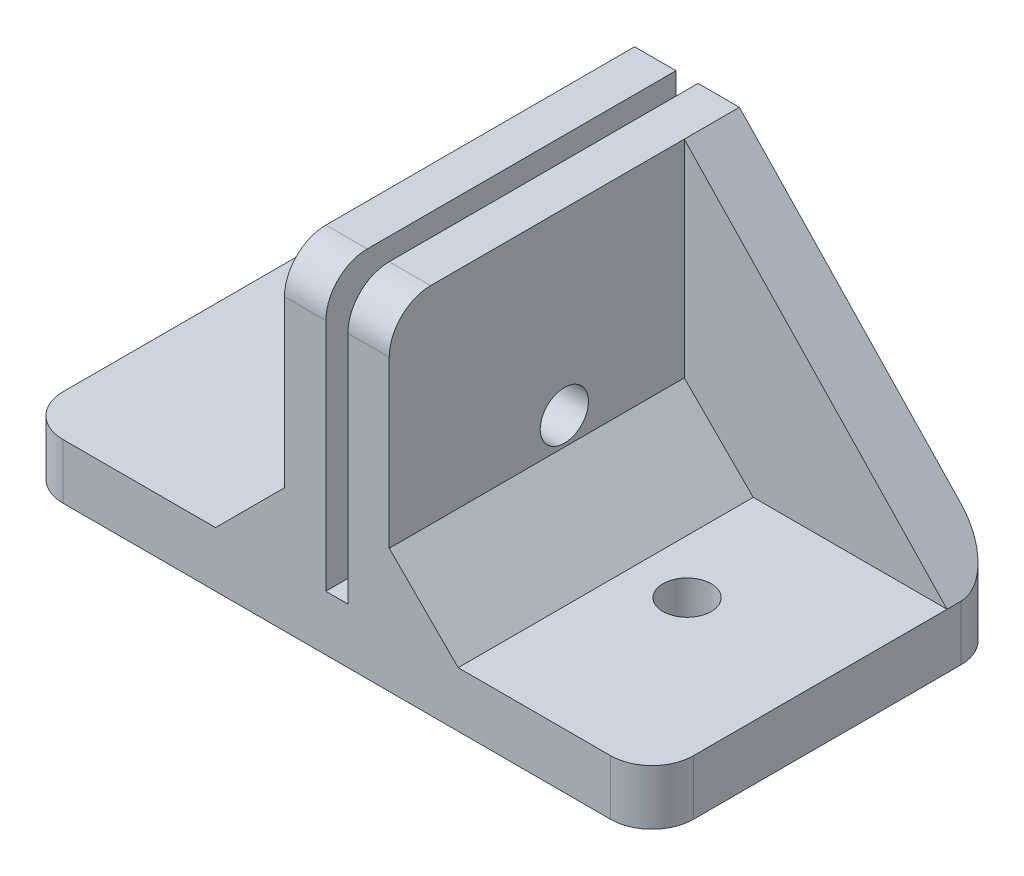
ISO-10303-21;
HEADER;
FILE_DESCRIPTION(('STEP AP214'),'2;1');
FILE_NAME('part.step','',(''),(''),'','','');
FILE_SCHEMA(('AUTOMOTIVE_DESIGN { 1 0 10303 214 1 1 1 1 }'));
ENDSEC;
DATA;
#1=APPLICATION_CONTEXT('core data for automotive mechanical design processes');
#2=APPLICATION_PROTOCOL_DEFINITION('international standard','automotive_design',2000,#1);
#3=PRODUCT_CONTEXT('',#1,'mechanical');
#4=PRODUCT('Part','Part','',(#3));
#5=PRODUCT_RELATED_PRODUCT_CATEGORY('part','',(#4));
#6=PRODUCT_DEFINITION_FORMATION('','',#4);
#7=PRODUCT_DEFINITION_CONTEXT('part definition',#1,'design');
#8=PRODUCT_DEFINITION('design','',#6,#7);
#9=PRODUCT_DEFINITION_SHAPE('','',#8);
#10=(LENGTH_UNIT() NAMED_UNIT(*) SI_UNIT(.MILLI.,.METRE.));
#11=(NAMED_UNIT(*) PLANE_ANGLE_UNIT() SI_UNIT($,.RADIAN.));
#12=(NAMED_UNIT(*) SI_UNIT($,.STERADIAN.) SOLID_ANGLE_UNIT());
#13=UNCERTAINTY_MEASURE_WITH_UNIT(LENGTH_MEASURE(1.E-05),#10,'distance_accuracy_value','');
#14=(GEOMETRIC_REPRESENTATION_CONTEXT(3) GLOBAL_UNCERTAINTY_ASSIGNED_CONTEXT((#13)) GLOBAL_UNIT_ASSIGNED_CONTEXT((#10,
#11,#12)) REPRESENTATION_CONTEXT('',''));
#15=CARTESIAN_POINT('',(0.,0.,0.));
#16=DIRECTION('',(0.,0.,1.));
#17=DIRECTION('',(1.,0.,0.));
#18=AXIS2_PLACEMENT_3D('',#15,#16,#17);
#19=CARTESIAN_POINT('',(0.,4.,0.));
#20=DIRECTION('',(0.,1.,0.));
#21=DIRECTION('',(0.,0.,1.));
#22=AXIS2_PLACEMENT_3D('',#19,#20,#21);
#23=PLANE('',#22);
#24=DIRECTION('',(1.,0.,0.));
#25=VECTOR('',#24,1.);
#26=CARTESIAN_POINT('',(-22.86,4.,12.7));
#27=LINE('',#26,#25);
#28=CARTESIAN_POINT('',(-0.799999999999999,4.,12.7));
#29=VERTEX_POINT('',#28);
#30=CARTESIAN_POINT('',(0.800000000000002,4.,12.7));
#31=VERTEX_POINT('',#30);
#32=EDGE_CURVE('E248',#29,#31,#27,.T.);
#33=ORIENTED_EDGE('',*,*,#32,.T.);
#34=DIRECTION('',(0.,0.,1.));
#35=VECTOR('',#34,1.);
#36=CARTESIAN_POINT('',(0.799999999999999,4.,-12.7));
#37=LINE('',#36,#35);
#38=CARTESIAN_POINT('',(0.799999999999999,4.,-12.7));
#39=VERTEX_POINT('',#38);
#40=EDGE_CURVE('E368',#39,#31,#37,.T.);
#41=ORIENTED_EDGE('',*,*,#40,.F.);
#42=DIRECTION('',(-1.,0.,0.));
#43=VECTOR('',#42,1.);
#44=CARTESIAN_POINT('',(-22.86,4.,-12.7));
#45=LINE('',#44,#43);
#46=CARTESIAN_POINT('',(-0.800000000000001,4.,-12.7));
#47=VERTEX_POINT('',#46);
#48=EDGE_CURVE('E239',#39,#47,#45,.T.);
#49=ORIENTED_EDGE('',*,*,#48,.T.);
#50=DIRECTION('',(0.,0.,-1.));
#51=VECTOR('',#50,1.);
#52=CARTESIAN_POINT('',(-0.800000000000001,4.,-12.7));
#53=LINE('',#52,#51);
#54=EDGE_CURVE('E215',#29,#47,#53,.T.);
#55=ORIENTED_EDGE('',*,*,#54,.F.);
#56=EDGE_LOOP('',(#33,#41,#49,#55));
#57=FACE_BOUND('',#56,.T.);
#58=ADVANCED_FACE('F35',(#57),#23,.T.);
#59=CARTESIAN_POINT('',(12.7,4.,0.));
#60=DIRECTION('',(0.,-1.,0.));
#61=DIRECTION('',(0.,0.,-1.));
#62=AXIS2_PLACEMENT_3D('',#59,#60,#61);
#63=CIRCLE('',#62,1.75);
#64=CARTESIAN_POINT('',(12.7,4.,-1.75));
#65=VERTEX_POINT('',#64);
#66=EDGE_CURVE('E444',#65,#65,#63,.T.);
#67=ORIENTED_EDGE('',*,*,#66,.T.);
#68=EDGE_LOOP('',(#67));
#69=FACE_BOUND('',#68,.T.);
#70=CARTESIAN_POINT('',(8.79999999999999,4.,12.7));
#71=VERTEX_POINT('',#70);
#72=CARTESIAN_POINT('',(19.86,4.,12.7));
#73=VERTEX_POINT('',#72);
#74=EDGE_CURVE('E244',#71,#73,#27,.T.);
#75=ORIENTED_EDGE('',*,*,#74,.T.);
#76=CARTESIAN_POINT('',(19.86,4.,9.7));
#77=DIRECTION('',(0.,1.,0.));
#78=DIRECTION('',(0.,0.,1.));
#79=AXIS2_PLACEMENT_3D('',#76,#77,#78);
#80=CIRCLE('',#79,3.);
#81=CARTESIAN_POINT('',(22.86,4.,9.7));
#82=VERTEX_POINT('',#81);
#83=EDGE_CURVE('E323',#73,#82,#80,.T.);
#84=ORIENTED_EDGE('',*,*,#83,.T.);
#85=DIRECTION('',(0.,0.,-1.));
#86=VECTOR('',#85,1.);
#87=CARTESIAN_POINT('',(22.86,4.,-12.7));
#88=LINE('',#87,#86);
#89=CARTESIAN_POINT('',(22.86,4.,-8.7));
#90=VERTEX_POINT('',#89);
#91=EDGE_CURVE('E237',#82,#90,#88,.T.);
#92=ORIENTED_EDGE('',*,*,#91,.T.);
#93=DIRECTION('',(-1.,0.,0.));
#94=VECTOR('',#93,1.);
#95=CARTESIAN_POINT('',(22.86,4.,-8.7));
#96=LINE('',#95,#94);
#97=CARTESIAN_POINT('',(8.79999999999999,4.,-8.7));
#98=VERTEX_POINT('',#97);
#99=EDGE_CURVE('E361',#90,#98,#96,.T.);
#100=ORIENTED_EDGE('',*,*,#99,.T.);
#101=DIRECTION('',(0.,0.,1.));
#102=VECTOR('',#101,1.);
#103=CARTESIAN_POINT('',(8.79999999999999,4.,0.));
#104=LINE('',#103,#102);
#105=EDGE_CURVE('E260',#98,#71,#104,.T.);
#106=ORIENTED_EDGE('',*,*,#105,.T.);
#107=EDGE_LOOP('',(#75,#84,#92,#100,#106));
#108=FACE_BOUND('',#107,.T.);
#109=ADVANCED_FACE('F422',(#69,#108),#23,.T.);
#110=CARTESIAN_POINT('',(-12.7,4.,0.));
#111=DIRECTION('',(0.,-1.,0.));
#112=DIRECTION('',(0.,0.,-1.));
#113=AXIS2_PLACEMENT_3D('',#110,#111,#112);
#114=CIRCLE('',#113,1.75);
#115=CARTESIAN_POINT('',(-12.7,4.,-1.75));
#116=VERTEX_POINT('',#115);
#117=EDGE_CURVE('E355',#116,#116,#114,.T.);
#118=ORIENTED_EDGE('',*,*,#117,.T.);
#119=EDGE_LOOP('',(#118));
#120=FACE_BOUND('',#119,.T.);
#121=DIRECTION('',(0.,0.,1.));
#122=VECTOR('',#121,1.);
#123=CARTESIAN_POINT('',(-22.86,4.,-12.7));
#124=LINE('',#123,#122);
#125=CARTESIAN_POINT('',(-22.86,4.,-8.7));
#126=VERTEX_POINT('',#125);
#127=CARTESIAN_POINT('',(-22.86,4.,9.7));
#128=VERTEX_POINT('',#127);
#129=EDGE_CURVE('E242',#126,#128,#124,.T.);
#130=ORIENTED_EDGE('',*,*,#129,.T.);
#131=CARTESIAN_POINT('',(-19.86,4.,9.7));
#132=DIRECTION('',(0.,1.,0.));
#133=DIRECTION('',(0.,0.,1.));
#134=AXIS2_PLACEMENT_3D('',#131,#132,#133);
#135=CIRCLE('',#134,3.);
#136=CARTESIAN_POINT('',(-19.86,4.,12.7));
#137=VERTEX_POINT('',#136);
#138=EDGE_CURVE('E11',#128,#137,#135,.T.);
#139=ORIENTED_EDGE('',*,*,#138,.T.);
#140=CARTESIAN_POINT('',(-8.79999999999997,4.,12.7));
#141=VERTEX_POINT('',#140);
#142=EDGE_CURVE('E245',#137,#141,#27,.T.);
#143=ORIENTED_EDGE('',*,*,#142,.T.);
#144=DIRECTION('',(0.,0.,-1.));
#145=VECTOR('',#144,1.);
#146=CARTESIAN_POINT('',(-8.79999999999998,4.,0.));
#147=LINE('',#146,#145);
#148=CARTESIAN_POINT('',(-8.79999999999998,4.,-8.7));
#149=VERTEX_POINT('',#148);
#150=EDGE_CURVE('E264',#141,#149,#147,.T.);
#151=ORIENTED_EDGE('',*,*,#150,.T.);
#152=DIRECTION('',(-1.,0.,0.));
#153=VECTOR('',#152,1.);
#154=CARTESIAN_POINT('',(-3.8,4.,-8.7));
#155=LINE('',#154,#153);
#156=EDGE_CURVE('E196',#149,#126,#155,.T.);
#157=ORIENTED_EDGE('',*,*,#156,.T.);
#158=EDGE_LOOP('',(#130,#139,#143,#151,#157));
#159=FACE_BOUND('',#158,.T.);
#160=ADVANCED_FACE('F347',(#120,#159),#23,.T.);
#161=CARTESIAN_POINT('',(22.86,4.,-12.7));
#162=DIRECTION('',(-1.,0.,0.));
#163=DIRECTION('',(0.,0.,1.));
#164=AXIS2_PLACEMENT_3D('',#161,#162,#163);
#165=PLANE('',#164);
#166=DIRECTION('',(0.,0.,-1.));
#167=VECTOR('',#166,1.);
#168=CARTESIAN_POINT('',(22.86,0.,-12.7));
#169=LINE('',#168,#167);
#170=CARTESIAN_POINT('',(22.86,0.,9.7));
#171=VERTEX_POINT('',#170);
#172=CARTESIAN_POINT('',(22.86,0.,-9.7));
#173=VERTEX_POINT('',#172);
#174=EDGE_CURVE('E236',#171,#173,#169,.T.);
#175=ORIENTED_EDGE('',*,*,#174,.T.);
#176=DIRECTION('',(0.,-1.,0.));
#177=VECTOR('',#176,1.);
#178=CARTESIAN_POINT('',(22.86,4.,-9.7));
#179=LINE('',#178,#177);
#180=CARTESIAN_POINT('',(22.86,4.,-9.7));
#181=VERTEX_POINT('',#180);
#182=EDGE_CURVE('E319',#173,#181,#179,.F.);
#183=ORIENTED_EDGE('',*,*,#182,.T.);
#184=DIRECTION('',(0.,0.,-1.));
#185=VECTOR('',#184,1.);
#186=CARTESIAN_POINT('',(22.86,4.,-8.7));
#187=LINE('',#186,#185);
#188=EDGE_CURVE('E365',#90,#181,#187,.T.);
#189=ORIENTED_EDGE('',*,*,#188,.F.);
#190=ORIENTED_EDGE('',*,*,#91,.F.);
#191=DIRECTION('',(0.,-1.,0.));
#192=VECTOR('',#191,1.);
#193=CARTESIAN_POINT('',(22.86,4.,9.7));
#194=LINE('',#193,#192);
#195=EDGE_CURVE('E316',#82,#171,#194,.T.);
#196=ORIENTED_EDGE('',*,*,#195,.T.);
#197=EDGE_LOOP('',(#175,#183,#189,#190,#196));
#198=FACE_BOUND('',#197,.T.);
#199=ADVANCED_FACE('F431',(#198),#165,.F.);
#200=CARTESIAN_POINT('',(-22.86,4.,-12.7));
#201=DIRECTION('',(0.,0.,1.));
#202=DIRECTION('',(1.,0.,0.));
#203=AXIS2_PLACEMENT_3D('',#200,#201,#202);
#204=PLANE('',#203);
#205=DIRECTION('',(0.689890128427108,-0.723914090689516,0.));
#206=VECTOR('',#205,1.);
#207=CARTESIAN_POINT('',(3.8,24.,-12.7));
#208=LINE('',#207,#206);
#209=CARTESIAN_POINT('',(3.8,24.,-12.7));
#210=VERTEX_POINT('',#209);
#211=CARTESIAN_POINT('',(19.86,7.1479538300105,-12.7));
#212=VERTEX_POINT('',#211);
#213=EDGE_CURVE('E348',#210,#212,#208,.T.);
#214=ORIENTED_EDGE('',*,*,#213,.T.);
#215=DIRECTION('',(0.,-1.,0.));
#216=VECTOR('',#215,1.);
#217=CARTESIAN_POINT('',(19.86,4.,-12.7));
#218=LINE('',#217,#216);
#219=CARTESIAN_POINT('',(19.86,0.,-12.7));
#220=VERTEX_POINT('',#219);
#221=EDGE_CURVE('E305',#212,#220,#218,.T.);
#222=ORIENTED_EDGE('',*,*,#221,.T.);
#223=DIRECTION('',(-1.,0.,0.));
#224=VECTOR('',#223,1.);
#225=CARTESIAN_POINT('',(-22.86,0.,-12.7));
#226=LINE('',#225,#224);
#227=CARTESIAN_POINT('',(-19.86,0.,-12.7));
#228=VERTEX_POINT('',#227);
#229=EDGE_CURVE('E251',#220,#228,#226,.T.);
#230=ORIENTED_EDGE('',*,*,#229,.T.);
#231=DIRECTION('',(0.,-1.,0.));
#232=VECTOR('',#231,1.);
#233=CARTESIAN_POINT('',(-19.86,4.,-12.7));
#234=LINE('',#233,#232);
#235=CARTESIAN_POINT('',(-19.86,7.14795383001049,-12.7));
#236=VERTEX_POINT('',#235);
#237=EDGE_CURVE('E303',#228,#236,#234,.F.);
#238=ORIENTED_EDGE('',*,*,#237,.T.);
#239=DIRECTION('',(0.689890128427108,0.723914090689516,0.));
#240=VECTOR('',#239,1.);
#241=CARTESIAN_POINT('',(-22.86,4.,-12.7));
#242=LINE('',#241,#240);
#243=CARTESIAN_POINT('',(-3.8,24.,-12.7));
#244=VERTEX_POINT('',#243);
#245=EDGE_CURVE('E204',#236,#244,#242,.T.);
#246=ORIENTED_EDGE('',*,*,#245,.T.);
#247=DIRECTION('',(-1.,0.,0.));
#248=VECTOR('',#247,1.);
#249=CARTESIAN_POINT('',(-3.8,24.,-12.7));
#250=LINE('',#249,#248);
#251=CARTESIAN_POINT('',(-0.800000000000001,24.,-12.7));
#252=VERTEX_POINT('',#251);
#253=EDGE_CURVE('E219',#252,#244,#250,.T.);
#254=ORIENTED_EDGE('',*,*,#253,.F.);
#255=DIRECTION('',(0.,-1.,0.));
#256=VECTOR('',#255,1.);
#257=CARTESIAN_POINT('',(-0.800000000000001,24.,-12.7));
#258=LINE('',#257,#256);
#259=EDGE_CURVE('E227',#252,#47,#258,.T.);
#260=ORIENTED_EDGE('',*,*,#259,.T.);
#261=ORIENTED_EDGE('',*,*,#48,.F.);
#262=DIRECTION('',(0.,-1.,0.));
#263=VECTOR('',#262,1.);
#264=CARTESIAN_POINT('',(0.799999999999999,24.,-12.7));
#265=LINE('',#264,#263);
#266=CARTESIAN_POINT('',(0.799999999999999,24.,-12.7));
#267=VERTEX_POINT('',#266);
#268=EDGE_CURVE('E378',#267,#39,#265,.T.);
#269=ORIENTED_EDGE('',*,*,#268,.F.);
#270=DIRECTION('',(-1.,0.,0.));
#271=VECTOR('',#270,1.);
#272=CARTESIAN_POINT('',(0.799999999999999,24.,-12.7));
#273=LINE('',#272,#271);
#274=EDGE_CURVE('E376',#210,#267,#273,.T.);
#275=ORIENTED_EDGE('',*,*,#274,.F.);
#276=EDGE_LOOP('',(#214,#222,#230,#238,#246,#254,#260,#261,#269,#275));
#277=FACE_BOUND('',#276,.T.);
#278=ADVANCED_FACE('F399',(#277),#204,.F.);
#279=CARTESIAN_POINT('',(-22.86,4.,-12.7));
#280=DIRECTION('',(1.,0.,0.));
#281=DIRECTION('',(0.,0.,-1.));
#282=AXIS2_PLACEMENT_3D('',#279,#280,#281);
#283=PLANE('',#282);
#284=CARTESIAN_POINT('',(-22.86,4.,-9.7));
#285=VERTEX_POINT('',#284);
#286=EDGE_CURVE('E203',#285,#126,#124,.T.);
#287=ORIENTED_EDGE('',*,*,#286,.F.);
#288=DIRECTION('',(0.,-1.,0.));
#289=VECTOR('',#288,1.);
#290=CARTESIAN_POINT('',(-22.86,4.,-9.7));
#291=LINE('',#290,#289);
#292=CARTESIAN_POINT('',(-22.86,0.,-9.7));
#293=VERTEX_POINT('',#292);
#294=EDGE_CURVE('E326',#285,#293,#291,.T.);
#295=ORIENTED_EDGE('',*,*,#294,.T.);
#296=DIRECTION('',(0.,0.,1.));
#297=VECTOR('',#296,1.);
#298=CARTESIAN_POINT('',(-22.86,0.,-12.7));
#299=LINE('',#298,#297);
#300=CARTESIAN_POINT('',(-22.86,0.,9.7));
#301=VERTEX_POINT('',#300);
#302=EDGE_CURVE('E254',#293,#301,#299,.T.);
#303=ORIENTED_EDGE('',*,*,#302,.T.);
#304=DIRECTION('',(0.,-1.,0.));
#305=VECTOR('',#304,1.);
#306=CARTESIAN_POINT('',(-22.86,4.,9.7));
#307=LINE('',#306,#305);
#308=EDGE_CURVE('E57',#301,#128,#307,.F.);
#309=ORIENTED_EDGE('',*,*,#308,.T.);
#310=ORIENTED_EDGE('',*,*,#129,.F.);
#311=EDGE_LOOP('',(#287,#295,#303,#309,#310));
#312=FACE_BOUND('',#311,.T.);
#313=ADVANCED_FACE('F330',(#312),#283,.F.);
#314=CARTESIAN_POINT('',(-22.86,4.,12.7));
#315=DIRECTION('',(0.,0.,-1.));
#316=DIRECTION('',(-1.,0.,0.));
#317=AXIS2_PLACEMENT_3D('',#314,#315,#316);
#318=PLANE('',#317);
#319=DIRECTION('',(0.,-1.,0.));
#320=VECTOR('',#319,1.);
#321=CARTESIAN_POINT('',(3.8,24.,12.7));
#322=LINE('',#321,#320);
#323=CARTESIAN_POINT('',(3.8,21.,12.7));
#324=VERTEX_POINT('',#323);
#325=CARTESIAN_POINT('',(3.8,9.00000000000004,12.7));
#326=VERTEX_POINT('',#325);
#327=EDGE_CURVE('E382',#324,#326,#322,.T.);
#328=ORIENTED_EDGE('',*,*,#327,.F.);
#329=DIRECTION('',(1.,0.,0.));
#330=VECTOR('',#329,1.);
#331=CARTESIAN_POINT('',(0.800000000000002,21.,12.7));
#332=LINE('',#331,#330);
#333=CARTESIAN_POINT('',(0.800000000000002,21.,12.7));
#334=VERTEX_POINT('',#333);
#335=EDGE_CURVE('E294',#324,#334,#332,.F.);
#336=ORIENTED_EDGE('',*,*,#335,.T.);
#337=DIRECTION('',(0.,-1.,0.));
#338=VECTOR('',#337,1.);
#339=CARTESIAN_POINT('',(0.800000000000002,24.,12.7));
#340=LINE('',#339,#338);
#341=EDGE_CURVE('E223',#334,#31,#340,.T.);
#342=ORIENTED_EDGE('',*,*,#341,.T.);
#343=ORIENTED_EDGE('',*,*,#32,.F.);
#344=DIRECTION('',(0.,-1.,0.));
#345=VECTOR('',#344,1.);
#346=CARTESIAN_POINT('',(-0.799999999999999,24.,12.7));
#347=LINE('',#346,#345);
#348=CARTESIAN_POINT('',(-0.799999999999999,21.,12.7));
#349=VERTEX_POINT('',#348);
#350=EDGE_CURVE('E232',#349,#29,#347,.T.);
#351=ORIENTED_EDGE('',*,*,#350,.F.);
#352=DIRECTION('',(1.,0.,0.));
#353=VECTOR('',#352,1.);
#354=CARTESIAN_POINT('',(-3.8,21.,12.7));
#355=LINE('',#354,#353);
#356=CARTESIAN_POINT('',(-3.8,21.,12.7));
#357=VERTEX_POINT('',#356);
#358=EDGE_CURVE('E292',#349,#357,#355,.F.);
#359=ORIENTED_EDGE('',*,*,#358,.T.);
#360=DIRECTION('',(0.,-1.,0.));
#361=VECTOR('',#360,1.);
#362=CARTESIAN_POINT('',(-3.8,24.,12.7));
#363=LINE('',#362,#361);
#364=CARTESIAN_POINT('',(-3.8,9.00000000000003,12.7));
#365=VERTEX_POINT('',#364);
#366=EDGE_CURVE('E234',#357,#365,#363,.T.);
#367=ORIENTED_EDGE('',*,*,#366,.T.);
#368=DIRECTION('',(-0.707106781186544,-0.707106781186551,0.));
#369=VECTOR('',#368,1.);
#370=CARTESIAN_POINT('',(-15.8299999999999,-3.03000000000001,12.7));
#371=LINE('',#370,#369);
#372=EDGE_CURVE('E270',#365,#141,#371,.T.);
#373=ORIENTED_EDGE('',*,*,#372,.T.);
#374=ORIENTED_EDGE('',*,*,#142,.F.);
#375=DIRECTION('',(0.,-1.,0.));
#376=VECTOR('',#375,1.);
#377=CARTESIAN_POINT('',(-19.86,4.,12.7));
#378=LINE('',#377,#376);
#379=CARTESIAN_POINT('',(-19.86,0.,12.7));
#380=VERTEX_POINT('',#379);
#381=EDGE_CURVE('E287',#137,#380,#378,.T.);
#382=ORIENTED_EDGE('',*,*,#381,.T.);
#383=DIRECTION('',(1.,0.,0.));
#384=VECTOR('',#383,1.);
#385=CARTESIAN_POINT('',(-22.86,0.,12.7));
#386=LINE('',#385,#384);
#387=CARTESIAN_POINT('',(19.86,0.,12.7));
#388=VERTEX_POINT('',#387);
#389=EDGE_CURVE('E240',#380,#388,#386,.T.);
#390=ORIENTED_EDGE('',*,*,#389,.T.);
#391=DIRECTION('',(0.,-1.,0.));
#392=VECTOR('',#391,1.);
#393=CARTESIAN_POINT('',(19.86,4.,12.7));
#394=LINE('',#393,#392);
#395=EDGE_CURVE('E290',#388,#73,#394,.F.);
#396=ORIENTED_EDGE('',*,*,#395,.T.);
#397=ORIENTED_EDGE('',*,*,#74,.F.);
#398=DIRECTION('',(-0.707106781186544,0.707106781186551,0.));
#399=VECTOR('',#398,1.);
#400=CARTESIAN_POINT('',(-7.02999999999984,19.83,12.7));
#401=LINE('',#400,#399);
#402=EDGE_CURVE('E267',#71,#326,#401,.T.);
#403=ORIENTED_EDGE('',*,*,#402,.T.);
#404=EDGE_LOOP('',(#328,#336,#342,#343,#351,#359,#367,#373,#374,#382,#390,#396,#397,#403));
#405=FACE_BOUND('',#404,.T.);
#406=ADVANCED_FACE('F342',(#405),#318,.F.);
#407=CARTESIAN_POINT('',(0.,0.,0.));
#408=DIRECTION('',(0.,1.,0.));
#409=DIRECTION('',(0.,0.,1.));
#410=AXIS2_PLACEMENT_3D('',#407,#408,#409);
#411=PLANE('',#410);
#412=CARTESIAN_POINT('',(12.7,0.,0.));
#413=DIRECTION('',(0.,-1.,0.));
#414=DIRECTION('',(0.,0.,-1.));
#415=AXIS2_PLACEMENT_3D('',#412,#413,#414);
#416=CIRCLE('',#415,1.75);
#417=CARTESIAN_POINT('',(12.7,0.,-1.75));
#418=VERTEX_POINT('',#417);
#419=EDGE_CURVE('E447',#418,#418,#416,.T.);
#420=ORIENTED_EDGE('',*,*,#419,.F.);
#421=EDGE_LOOP('',(#420));
#422=FACE_BOUND('',#421,.T.);
#423=CARTESIAN_POINT('',(-12.7,0.,0.));
#424=DIRECTION('',(0.,-1.,0.));
#425=DIRECTION('',(0.,0.,-1.));
#426=AXIS2_PLACEMENT_3D('',#423,#424,#425);
#427=CIRCLE('',#426,1.75);
#428=CARTESIAN_POINT('',(-12.7,0.,-1.75));
#429=VERTEX_POINT('',#428);
#430=EDGE_CURVE('E441',#429,#429,#427,.T.);
#431=ORIENTED_EDGE('',*,*,#430,.F.);
#432=EDGE_LOOP('',(#431));
#433=FACE_BOUND('',#432,.T.);
#434=ORIENTED_EDGE('',*,*,#229,.F.);
#435=CARTESIAN_POINT('',(19.86,0.,-9.7));
#436=DIRECTION('',(0.,1.,0.));
#437=DIRECTION('',(0.,0.,1.));
#438=AXIS2_PLACEMENT_3D('',#435,#436,#437);
#439=CIRCLE('',#438,3.);
#440=EDGE_CURVE('E314',#220,#173,#439,.F.);
#441=ORIENTED_EDGE('',*,*,#440,.T.);
#442=ORIENTED_EDGE('',*,*,#174,.F.);
#443=CARTESIAN_POINT('',(19.86,0.,9.7));
#444=DIRECTION('',(0.,1.,0.));
#445=DIRECTION('',(0.,0.,1.));
#446=AXIS2_PLACEMENT_3D('',#443,#444,#445);
#447=CIRCLE('',#446,3.);
#448=EDGE_CURVE('E312',#171,#388,#447,.F.);
#449=ORIENTED_EDGE('',*,*,#448,.T.);
#450=ORIENTED_EDGE('',*,*,#389,.F.);
#451=CARTESIAN_POINT('',(-19.86,0.,9.7));
#452=DIRECTION('',(0.,1.,0.));
#453=DIRECTION('',(0.,0.,1.));
#454=AXIS2_PLACEMENT_3D('',#451,#452,#453);
#455=CIRCLE('',#454,3.);
#456=EDGE_CURVE('E308',#380,#301,#455,.F.);
#457=ORIENTED_EDGE('',*,*,#456,.T.);
#458=ORIENTED_EDGE('',*,*,#302,.F.);
#459=CARTESIAN_POINT('',(-19.86,0.,-9.7));
#460=DIRECTION('',(0.,1.,0.));
#461=DIRECTION('',(0.,0.,1.));
#462=AXIS2_PLACEMENT_3D('',#459,#460,#461);
#463=CIRCLE('',#462,3.);
#464=EDGE_CURVE('E310',#293,#228,#463,.F.);
#465=ORIENTED_EDGE('',*,*,#464,.T.);
#466=EDGE_LOOP('',(#434,#441,#442,#449,#450,#457,#458,#465));
#467=FACE_BOUND('',#466,.T.);
#468=ADVANCED_FACE('F334',(#422,#433,#467),#411,.F.);
#469=CARTESIAN_POINT('',(-3.8,24.,-12.7));
#470=DIRECTION('',(1.,0.,0.));
#471=DIRECTION('',(0.,0.,-1.));
#472=AXIS2_PLACEMENT_3D('',#469,#470,#471);
#473=PLANE('',#472);
#474=CARTESIAN_POINT('',(-3.8,11.,0.));
#475=DIRECTION('',(-1.,0.,0.));
#476=DIRECTION('',(0.,0.,1.));
#477=AXIS2_PLACEMENT_3D('',#474,#475,#476);
#478=CIRCLE('',#477,1.75);
#479=CARTESIAN_POINT('',(-3.8,11.,1.75));
#480=VERTEX_POINT('',#479);
#481=EDGE_CURVE('E282',#480,#480,#478,.T.);
#482=ORIENTED_EDGE('',*,*,#481,.F.);
#483=EDGE_LOOP('',(#482));
#484=FACE_BOUND('',#483,.T.);
#485=ORIENTED_EDGE('',*,*,#366,.F.);
#486=CARTESIAN_POINT('',(-3.8,21.,9.7));
#487=DIRECTION('',(1.,0.,0.));
#488=DIRECTION('',(0.,0.,-1.));
#489=AXIS2_PLACEMENT_3D('',#486,#487,#488);
#490=CIRCLE('',#489,3.);
#491=CARTESIAN_POINT('',(-3.8,24.,9.7));
#492=VERTEX_POINT('',#491);
#493=EDGE_CURVE('E211',#357,#492,#490,.F.);
#494=ORIENTED_EDGE('',*,*,#493,.T.);
#495=DIRECTION('',(0.,0.,1.));
#496=VECTOR('',#495,1.);
#497=CARTESIAN_POINT('',(-3.8,24.,-12.7));
#498=LINE('',#497,#496);
#499=CARTESIAN_POINT('',(-3.8,24.,-8.7));
#500=VERTEX_POINT('',#499);
#501=EDGE_CURVE('E207',#500,#492,#498,.T.);
#502=ORIENTED_EDGE('',*,*,#501,.F.);
#503=DIRECTION('',(0.,-1.,0.));
#504=VECTOR('',#503,1.);
#505=CARTESIAN_POINT('',(-3.8,24.,-8.7));
#506=LINE('',#505,#504);
#507=CARTESIAN_POINT('',(-3.8,9.00000000000004,-8.7));
#508=VERTEX_POINT('',#507);
#509=EDGE_CURVE('E185',#500,#508,#506,.T.);
#510=ORIENTED_EDGE('',*,*,#509,.T.);
#511=DIRECTION('',(0.,0.,1.));
#512=VECTOR('',#511,1.);
#513=CARTESIAN_POINT('',(-3.8,9.00000000000003,-12.7));
#514=LINE('',#513,#512);
#515=EDGE_CURVE('E262',#508,#365,#514,.T.);
#516=ORIENTED_EDGE('',*,*,#515,.T.);
#517=EDGE_LOOP('',(#485,#494,#502,#510,#516));
#518=FACE_BOUND('',#517,.T.);
#519=ADVANCED_FACE('F209',(#484,#518),#473,.F.);
#520=CARTESIAN_POINT('',(-0.800000000000001,24.,-12.7));
#521=DIRECTION('',(-1.,0.,0.));
#522=DIRECTION('',(0.,0.,1.));
#523=AXIS2_PLACEMENT_3D('',#520,#521,#522);
#524=PLANE('',#523);
#525=CARTESIAN_POINT('',(-0.8,11.,0.));
#526=DIRECTION('',(-1.,0.,0.));
#527=DIRECTION('',(0.,0.,1.));
#528=AXIS2_PLACEMENT_3D('',#525,#526,#527);
#529=CIRCLE('',#528,1.75);
#530=CARTESIAN_POINT('',(-0.8,11.,1.75));
#531=VERTEX_POINT('',#530);
#532=EDGE_CURVE('E450',#531,#531,#529,.T.);
#533=ORIENTED_EDGE('',*,*,#532,.T.);
#534=EDGE_LOOP('',(#533));
#535=FACE_BOUND('',#534,.T.);
#536=DIRECTION('',(0.,0.,-1.));
#537=VECTOR('',#536,1.);
#538=CARTESIAN_POINT('',(-0.800000000000001,24.,-12.7));
#539=LINE('',#538,#537);
#540=CARTESIAN_POINT('',(-0.799999999999999,24.,9.7));
#541=VERTEX_POINT('',#540);
#542=EDGE_CURVE('E220',#541,#252,#539,.T.);
#543=ORIENTED_EDGE('',*,*,#542,.F.);
#544=CARTESIAN_POINT('',(-0.799999999999999,21.,9.7));
#545=DIRECTION('',(-1.,0.,0.));
#546=DIRECTION('',(0.,0.,1.));
#547=AXIS2_PLACEMENT_3D('',#544,#545,#546);
#548=CIRCLE('',#547,3.);
#549=EDGE_CURVE('E300',#541,#349,#548,.F.);
#550=ORIENTED_EDGE('',*,*,#549,.T.);
#551=ORIENTED_EDGE('',*,*,#350,.T.);
#552=ORIENTED_EDGE('',*,*,#54,.T.);
#553=ORIENTED_EDGE('',*,*,#259,.F.);
#554=EDGE_LOOP('',(#543,#550,#551,#552,#553));
#555=FACE_BOUND('',#554,.T.);
#556=ADVANCED_FACE('F403',(#535,#555),#524,.F.);
#557=CARTESIAN_POINT('',(0.,24.,0.));
#558=DIRECTION('',(0.,1.,0.));
#559=DIRECTION('',(0.,0.,1.));
#560=AXIS2_PLACEMENT_3D('',#557,#558,#559);
#561=PLANE('',#560);
#562=ORIENTED_EDGE('',*,*,#501,.T.);
#563=DIRECTION('',(1.,0.,0.));
#564=VECTOR('',#563,1.);
#565=CARTESIAN_POINT('',(-0.799999999999999,24.,9.7));
#566=LINE('',#565,#564);
#567=EDGE_CURVE('E298',#492,#541,#566,.T.);
#568=ORIENTED_EDGE('',*,*,#567,.T.);
#569=ORIENTED_EDGE('',*,*,#542,.T.);
#570=ORIENTED_EDGE('',*,*,#253,.T.);
#571=EDGE_CURVE('E201',#244,#500,#498,.T.);
#572=ORIENTED_EDGE('',*,*,#571,.T.);
#573=EDGE_LOOP('',(#562,#568,#569,#570,#572));
#574=FACE_BOUND('',#573,.T.);
#575=ADVANCED_FACE('F217',(#574),#561,.T.);
#576=CARTESIAN_POINT('',(0.799999999999999,24.,-12.7));
#577=DIRECTION('',(1.,0.,0.));
#578=DIRECTION('',(0.,0.,-1.));
#579=AXIS2_PLACEMENT_3D('',#576,#577,#578);
#580=PLANE('',#579);
#581=CARTESIAN_POINT('',(0.8,11.,0.));
#582=DIRECTION('',(1.,0.,0.));
#583=DIRECTION('',(0.,0.,-1.));
#584=AXIS2_PLACEMENT_3D('',#581,#582,#583);
#585=CIRCLE('',#584,1.75);
#586=CARTESIAN_POINT('',(0.8,11.,-1.75));
#587=VERTEX_POINT('',#586);
#588=EDGE_CURVE('E281',#587,#587,#585,.T.);
#589=ORIENTED_EDGE('',*,*,#588,.T.);
#590=EDGE_LOOP('',(#589));
#591=FACE_BOUND('',#590,.T.);
#592=ORIENTED_EDGE('',*,*,#341,.F.);
#593=CARTESIAN_POINT('',(0.800000000000001,21.,9.7));
#594=DIRECTION('',(1.,0.,0.));
#595=DIRECTION('',(0.,0.,-1.));
#596=AXIS2_PLACEMENT_3D('',#593,#594,#595);
#597=CIRCLE('',#596,3.);
#598=CARTESIAN_POINT('',(0.800000000000001,24.,9.7));
#599=VERTEX_POINT('',#598);
#600=EDGE_CURVE('E296',#334,#599,#597,.F.);
#601=ORIENTED_EDGE('',*,*,#600,.T.);
#602=DIRECTION('',(0.,0.,1.));
#603=VECTOR('',#602,1.);
#604=CARTESIAN_POINT('',(0.799999999999999,24.,-12.7));
#605=LINE('',#604,#603);
#606=EDGE_CURVE('E371',#267,#599,#605,.T.);
#607=ORIENTED_EDGE('',*,*,#606,.F.);
#608=ORIENTED_EDGE('',*,*,#268,.T.);
#609=ORIENTED_EDGE('',*,*,#40,.T.);
#610=EDGE_LOOP('',(#592,#601,#607,#608,#609));
#611=FACE_BOUND('',#610,.T.);
#612=ADVANCED_FACE('F394',(#591,#611),#580,.F.);
#613=CARTESIAN_POINT('',(3.8,24.,-12.7));
#614=DIRECTION('',(-1.,0.,0.));
#615=DIRECTION('',(0.,0.,1.));
#616=AXIS2_PLACEMENT_3D('',#613,#614,#615);
#617=PLANE('',#616);
#618=CARTESIAN_POINT('',(3.8,11.,0.));
#619=DIRECTION('',(-1.,0.,0.));
#620=DIRECTION('',(0.,0.,1.));
#621=AXIS2_PLACEMENT_3D('',#618,#619,#620);
#622=CIRCLE('',#621,1.75);
#623=CARTESIAN_POINT('',(3.8,11.,1.75));
#624=VERTEX_POINT('',#623);
#625=EDGE_CURVE('E278',#624,#624,#622,.T.);
#626=ORIENTED_EDGE('',*,*,#625,.T.);
#627=EDGE_LOOP('',(#626));
#628=FACE_BOUND('',#627,.T.);
#629=DIRECTION('',(0.,0.,-1.));
#630=VECTOR('',#629,1.);
#631=CARTESIAN_POINT('',(3.8,24.,-12.7));
#632=LINE('',#631,#630);
#633=CARTESIAN_POINT('',(3.8,24.,9.7));
#634=VERTEX_POINT('',#633);
#635=CARTESIAN_POINT('',(3.8,24.,-8.7));
#636=VERTEX_POINT('',#635);
#637=EDGE_CURVE('E374',#634,#636,#632,.T.);
#638=ORIENTED_EDGE('',*,*,#637,.F.);
#639=CARTESIAN_POINT('',(3.8,21.,9.7));
#640=DIRECTION('',(-1.,0.,0.));
#641=DIRECTION('',(0.,0.,1.));
#642=AXIS2_PLACEMENT_3D('',#639,#640,#641);
#643=CIRCLE('',#642,3.);
#644=EDGE_CURVE('E285',#634,#324,#643,.F.);
#645=ORIENTED_EDGE('',*,*,#644,.T.);
#646=ORIENTED_EDGE('',*,*,#327,.T.);
#647=DIRECTION('',(0.,0.,-1.));
#648=VECTOR('',#647,1.);
#649=CARTESIAN_POINT('',(3.8,9.00000000000004,-12.7));
#650=LINE('',#649,#648);
#651=CARTESIAN_POINT('',(3.8,9.00000000000004,-8.7));
#652=VERTEX_POINT('',#651);
#653=EDGE_CURVE('E247',#326,#652,#650,.T.);
#654=ORIENTED_EDGE('',*,*,#653,.T.);
#655=DIRECTION('',(0.,1.,0.));
#656=VECTOR('',#655,1.);
#657=CARTESIAN_POINT('',(3.8,4.,-8.7));
#658=LINE('',#657,#656);
#659=EDGE_CURVE('E351',#652,#636,#658,.T.);
#660=ORIENTED_EDGE('',*,*,#659,.T.);
#661=EDGE_LOOP('',(#638,#645,#646,#654,#660));
#662=FACE_BOUND('',#661,.T.);
#663=ADVANCED_FACE('F475',(#628,#662),#617,.F.);
#664=CARTESIAN_POINT('',(0.,24.,0.));
#665=DIRECTION('',(0.,1.,0.));
#666=DIRECTION('',(0.,0.,1.));
#667=AXIS2_PLACEMENT_3D('',#664,#665,#666);
#668=PLANE('',#667);
#669=ORIENTED_EDGE('',*,*,#606,.T.);
#670=DIRECTION('',(1.,0.,0.));
#671=VECTOR('',#670,1.);
#672=CARTESIAN_POINT('',(3.8,24.,9.7));
#673=LINE('',#672,#671);
#674=EDGE_CURVE('E277',#599,#634,#673,.T.);
#675=ORIENTED_EDGE('',*,*,#674,.T.);
#676=ORIENTED_EDGE('',*,*,#637,.T.);
#677=DIRECTION('',(0.,0.,-1.));
#678=VECTOR('',#677,1.);
#679=CARTESIAN_POINT('',(3.8,24.,-8.7));
#680=LINE('',#679,#678);
#681=EDGE_CURVE('E363',#636,#210,#680,.T.);
#682=ORIENTED_EDGE('',*,*,#681,.T.);
#683=ORIENTED_EDGE('',*,*,#274,.T.);
#684=EDGE_LOOP('',(#669,#675,#676,#682,#683));
#685=FACE_BOUND('',#684,.T.);
#686=ADVANCED_FACE('F479',(#685),#668,.T.);
#687=CARTESIAN_POINT('',(3.8,9.00000000000004,-12.7));
#688=DIRECTION('',(-0.707106781186551,-0.707106781186544,0.));
#689=DIRECTION('',(0.,0.,-1.));
#690=AXIS2_PLACEMENT_3D('',#687,#688,#689);
#691=PLANE('',#690);
#692=ORIENTED_EDGE('',*,*,#105,.F.);
#693=DIRECTION('',(-0.707106781186544,0.707106781186551,0.));
#694=VECTOR('',#693,1.);
#695=CARTESIAN_POINT('',(3.8,9.00000000000004,-8.7));
#696=LINE('',#695,#694);
#697=EDGE_CURVE('E273',#98,#652,#696,.T.);
#698=ORIENTED_EDGE('',*,*,#697,.T.);
#699=ORIENTED_EDGE('',*,*,#653,.F.);
#700=ORIENTED_EDGE('',*,*,#402,.F.);
#701=EDGE_LOOP('',(#692,#698,#699,#700));
#702=FACE_BOUND('',#701,.T.);
#703=ADVANCED_FACE('F483',(#702),#691,.F.);
#704=CARTESIAN_POINT('',(-3.8,9.00000000000003,-12.7));
#705=DIRECTION('',(0.707106781186551,-0.707106781186544,0.));
#706=DIRECTION('',(0.,0.,1.));
#707=AXIS2_PLACEMENT_3D('',#704,#705,#706);
#708=PLANE('',#707);
#709=ORIENTED_EDGE('',*,*,#515,.F.);
#710=DIRECTION('',(-0.707106781186544,-0.707106781186551,0.));
#711=VECTOR('',#710,1.);
#712=CARTESIAN_POINT('',(-3.8,9.00000000000003,-8.7));
#713=LINE('',#712,#711);
#714=EDGE_CURVE('E191',#508,#149,#713,.T.);
#715=ORIENTED_EDGE('',*,*,#714,.T.);
#716=ORIENTED_EDGE('',*,*,#150,.F.);
#717=ORIENTED_EDGE('',*,*,#372,.F.);
#718=EDGE_LOOP('',(#709,#715,#716,#717));
#719=FACE_BOUND('',#718,.T.);
#720=ADVANCED_FACE('F492',(#719),#708,.F.);
#721=CARTESIAN_POINT('',(0.,0.,-8.7));
#722=DIRECTION('',(0.,0.,1.));
#723=DIRECTION('',(1.,0.,0.));
#724=AXIS2_PLACEMENT_3D('',#721,#722,#723);
#725=PLANE('',#724);
#726=ORIENTED_EDGE('',*,*,#697,.F.);
#727=ORIENTED_EDGE('',*,*,#99,.F.);
#728=DIRECTION('',(0.689890128427108,-0.723914090689516,0.));
#729=VECTOR('',#728,1.);
#730=CARTESIAN_POINT('',(3.8,24.,-8.7));
#731=LINE('',#730,#729);
#732=EDGE_CURVE('E358',#636,#90,#731,.T.);
#733=ORIENTED_EDGE('',*,*,#732,.F.);
#734=ORIENTED_EDGE('',*,*,#659,.F.);
#735=EDGE_LOOP('',(#726,#727,#733,#734));
#736=FACE_BOUND('',#735,.T.);
#737=ADVANCED_FACE('F488',(#736),#725,.T.);
#738=CARTESIAN_POINT('',(3.8,24.,-8.7));
#739=DIRECTION('',(0.723914090689516,0.689890128427108,0.));
#740=DIRECTION('',(-0.689890128427108,0.723914090689516,0.));
#741=AXIS2_PLACEMENT_3D('',#738,#739,#740);
#742=PLANE('',#741);
#743=ORIENTED_EDGE('',*,*,#188,.T.);
#744=CARTESIAN_POINT('',(19.86,7.1479538300105,-9.7));
#745=DIRECTION('',(0.723914090689516,0.689890128427108,0.));
#746=DIRECTION('',(0.689890128427108,-0.723914090689516,0.));
#747=AXIS2_PLACEMENT_3D('',#744,#745,#746);
#748=ELLIPSE('',#747,4.34851851966595,3.);
#749=EDGE_CURVE('E321',#181,#212,#748,.T.);
#750=ORIENTED_EDGE('',*,*,#749,.T.);
#751=ORIENTED_EDGE('',*,*,#213,.F.);
#752=ORIENTED_EDGE('',*,*,#681,.F.);
#753=ORIENTED_EDGE('',*,*,#732,.T.);
#754=EDGE_LOOP('',(#743,#750,#751,#752,#753));
#755=FACE_BOUND('',#754,.T.);
#756=ADVANCED_FACE('F485',(#755),#742,.T.);
#757=CARTESIAN_POINT('',(0.,0.,-8.7));
#758=DIRECTION('',(0.,0.,1.));
#759=DIRECTION('',(1.,0.,0.));
#760=AXIS2_PLACEMENT_3D('',#757,#758,#759);
#761=PLANE('',#760);
#762=ORIENTED_EDGE('',*,*,#714,.F.);
#763=ORIENTED_EDGE('',*,*,#509,.F.);
#764=DIRECTION('',(0.689890128427108,0.723914090689516,0.));
#765=VECTOR('',#764,1.);
#766=CARTESIAN_POINT('',(-22.86,4.,-8.7));
#767=LINE('',#766,#765);
#768=EDGE_CURVE('E188',#126,#500,#767,.T.);
#769=ORIENTED_EDGE('',*,*,#768,.F.);
#770=ORIENTED_EDGE('',*,*,#156,.F.);
#771=EDGE_LOOP('',(#762,#763,#769,#770));
#772=FACE_BOUND('',#771,.T.);
#773=ADVANCED_FACE('F187',(#772),#761,.T.);
#774=CARTESIAN_POINT('',(-22.86,4.,-8.7));
#775=DIRECTION('',(-0.723914090689516,0.689890128427108,0.));
#776=DIRECTION('',(-0.689890128427108,-0.723914090689516,0.));
#777=AXIS2_PLACEMENT_3D('',#774,#775,#776);
#778=PLANE('',#777);
#779=ORIENTED_EDGE('',*,*,#245,.F.);
#780=CARTESIAN_POINT('',(-19.86,7.14795383001049,-9.7));
#781=DIRECTION('',(-0.723914090689516,0.689890128427108,0.));
#782=DIRECTION('',(-0.689890128427108,-0.723914090689516,0.));
#783=AXIS2_PLACEMENT_3D('',#780,#781,#782);
#784=ELLIPSE('',#783,4.34851851966595,3.);
#785=EDGE_CURVE('E43',#236,#285,#784,.T.);
#786=ORIENTED_EDGE('',*,*,#785,.T.);
#787=ORIENTED_EDGE('',*,*,#286,.T.);
#788=ORIENTED_EDGE('',*,*,#768,.T.);
#789=ORIENTED_EDGE('',*,*,#571,.F.);
#790=EDGE_LOOP('',(#779,#786,#787,#788,#789));
#791=FACE_BOUND('',#790,.T.);
#792=ADVANCED_FACE('F199',(#791),#778,.T.);
#793=CARTESIAN_POINT('',(-12.7,4.,0.));
#794=DIRECTION('',(0.,-1.,0.));
#795=DIRECTION('',(0.,0.,-1.));
#796=AXIS2_PLACEMENT_3D('',#793,#794,#795);
#797=CYLINDRICAL_SURFACE('',#796,1.75);
#798=ORIENTED_EDGE('',*,*,#117,.F.);
#799=EDGE_LOOP('',(#798));
#800=FACE_BOUND('',#799,.T.);
#801=ORIENTED_EDGE('',*,*,#430,.T.);
#802=EDGE_LOOP('',(#801));
#803=FACE_BOUND('',#802,.T.);
#804=ADVANCED_FACE('F496',(#800,#803),#797,.F.);
#805=CARTESIAN_POINT('',(12.7,4.,0.));
#806=DIRECTION('',(0.,-1.,0.));
#807=DIRECTION('',(0.,0.,-1.));
#808=AXIS2_PLACEMENT_3D('',#805,#806,#807);
#809=CYLINDRICAL_SURFACE('',#808,1.75);
#810=ORIENTED_EDGE('',*,*,#66,.F.);
#811=EDGE_LOOP('',(#810));
#812=FACE_BOUND('',#811,.T.);
#813=ORIENTED_EDGE('',*,*,#419,.T.);
#814=EDGE_LOOP('',(#813));
#815=FACE_BOUND('',#814,.T.);
#816=ADVANCED_FACE('F501',(#812,#815),#809,.F.);
#817=CARTESIAN_POINT('',(10.2,11.,0.));
#818=DIRECTION('',(-1.,0.,0.));
#819=DIRECTION('',(0.,0.,1.));
#820=AXIS2_PLACEMENT_3D('',#817,#818,#819);
#821=CYLINDRICAL_SURFACE('',#820,1.75);
#822=ORIENTED_EDGE('',*,*,#625,.F.);
#823=EDGE_LOOP('',(#822));
#824=FACE_BOUND('',#823,.T.);
#825=ORIENTED_EDGE('',*,*,#588,.F.);
#826=EDGE_LOOP('',(#825));
#827=FACE_BOUND('',#826,.T.);
#828=ADVANCED_FACE('F504',(#824,#827),#821,.F.);
#829=ORIENTED_EDGE('',*,*,#481,.T.);
#830=EDGE_LOOP('',(#829));
#831=FACE_BOUND('',#830,.T.);
#832=ORIENTED_EDGE('',*,*,#532,.F.);
#833=EDGE_LOOP('',(#832));
#834=FACE_BOUND('',#833,.T.);
#835=ADVANCED_FACE('F418',(#831,#834),#821,.F.);
#836=CARTESIAN_POINT('',(0.,21.,9.7));
#837=DIRECTION('',(-1.,0.,0.));
#838=DIRECTION('',(0.,0.,1.));
#839=AXIS2_PLACEMENT_3D('',#836,#837,#838);
#840=CYLINDRICAL_SURFACE('',#839,3.);
#841=ORIENTED_EDGE('',*,*,#600,.F.);
#842=ORIENTED_EDGE('',*,*,#335,.F.);
#843=ORIENTED_EDGE('',*,*,#644,.F.);
#844=ORIENTED_EDGE('',*,*,#674,.F.);
#845=EDGE_LOOP('',(#841,#842,#843,#844));
#846=FACE_BOUND('',#845,.T.);
#847=ADVANCED_FACE('F409',(#846),#840,.T.);
#848=CARTESIAN_POINT('',(0.,21.,9.7));
#849=DIRECTION('',(-1.,0.,0.));
#850=DIRECTION('',(0.,0.,1.));
#851=AXIS2_PLACEMENT_3D('',#848,#849,#850);
#852=CYLINDRICAL_SURFACE('',#851,3.);
#853=ORIENTED_EDGE('',*,*,#493,.F.);
#854=ORIENTED_EDGE('',*,*,#358,.F.);
#855=ORIENTED_EDGE('',*,*,#549,.F.);
#856=ORIENTED_EDGE('',*,*,#567,.F.);
#857=EDGE_LOOP('',(#853,#854,#855,#856));
#858=FACE_BOUND('',#857,.T.);
#859=ADVANCED_FACE('F406',(#858),#852,.T.);
#860=CARTESIAN_POINT('',(19.86,4.,-9.7));
#861=DIRECTION('',(0.,-1.,0.));
#862=DIRECTION('',(0.,0.,-1.));
#863=AXIS2_PLACEMENT_3D('',#860,#861,#862);
#864=CYLINDRICAL_SURFACE('',#863,3.);
#865=ORIENTED_EDGE('',*,*,#749,.F.);
#866=ORIENTED_EDGE('',*,*,#182,.F.);
#867=ORIENTED_EDGE('',*,*,#440,.F.);
#868=ORIENTED_EDGE('',*,*,#221,.F.);
#869=EDGE_LOOP('',(#865,#866,#867,#868));
#870=FACE_BOUND('',#869,.T.);
#871=ADVANCED_FACE('F408',(#870),#864,.T.);
#872=CARTESIAN_POINT('',(19.86,4.,9.7));
#873=DIRECTION('',(0.,-1.,0.));
#874=DIRECTION('',(0.,0.,-1.));
#875=AXIS2_PLACEMENT_3D('',#872,#873,#874);
#876=CYLINDRICAL_SURFACE('',#875,3.);
#877=ORIENTED_EDGE('',*,*,#83,.F.);
#878=ORIENTED_EDGE('',*,*,#395,.F.);
#879=ORIENTED_EDGE('',*,*,#448,.F.);
#880=ORIENTED_EDGE('',*,*,#195,.F.);
#881=EDGE_LOOP('',(#877,#878,#879,#880));
#882=FACE_BOUND('',#881,.T.);
#883=ADVANCED_FACE('F415',(#882),#876,.T.);
#884=CARTESIAN_POINT('',(-19.86,4.,-9.7));
#885=DIRECTION('',(0.,-1.,0.));
#886=DIRECTION('',(0.,0.,-1.));
#887=AXIS2_PLACEMENT_3D('',#884,#885,#886);
#888=CYLINDRICAL_SURFACE('',#887,3.);
#889=ORIENTED_EDGE('',*,*,#785,.F.);
#890=ORIENTED_EDGE('',*,*,#237,.F.);
#891=ORIENTED_EDGE('',*,*,#464,.F.);
#892=ORIENTED_EDGE('',*,*,#294,.F.);
#893=EDGE_LOOP('',(#889,#890,#891,#892));
#894=FACE_BOUND('',#893,.T.);
#895=ADVANCED_FACE('F637',(#894),#888,.T.);
#896=CARTESIAN_POINT('',(-19.86,4.,9.7));
#897=DIRECTION('',(0.,-1.,0.));
#898=DIRECTION('',(0.,0.,-1.));
#899=AXIS2_PLACEMENT_3D('',#896,#897,#898);
#900=CYLINDRICAL_SURFACE('',#899,3.);
#901=ORIENTED_EDGE('',*,*,#138,.F.);
#902=ORIENTED_EDGE('',*,*,#308,.F.);
#903=ORIENTED_EDGE('',*,*,#456,.F.);
#904=ORIENTED_EDGE('',*,*,#381,.F.);
#905=EDGE_LOOP('',(#901,#902,#903,#904));
#906=FACE_BOUND('',#905,.T.);
#907=ADVANCED_FACE('F37',(#906),#900,.T.);
#908=CLOSED_SHELL('',(#58,#109,#160,#199,#278,#313,#406,#468,#519,#556,#575,#612,#663,#686,#703,
#720,#737,#756,#773,#792,#804,#816,#828,#835,#847,#859,#871,#883,#895,#907));
#909=MANIFOLD_SOLID_BREP('B2',#908);
#910=ADVANCED_BREP_SHAPE_REPRESENTATION('',(#18,#909),#14);
#911=SHAPE_DEFINITION_REPRESENTATION(#9,#910);
ENDSEC;
END-ISO-10303-21;
